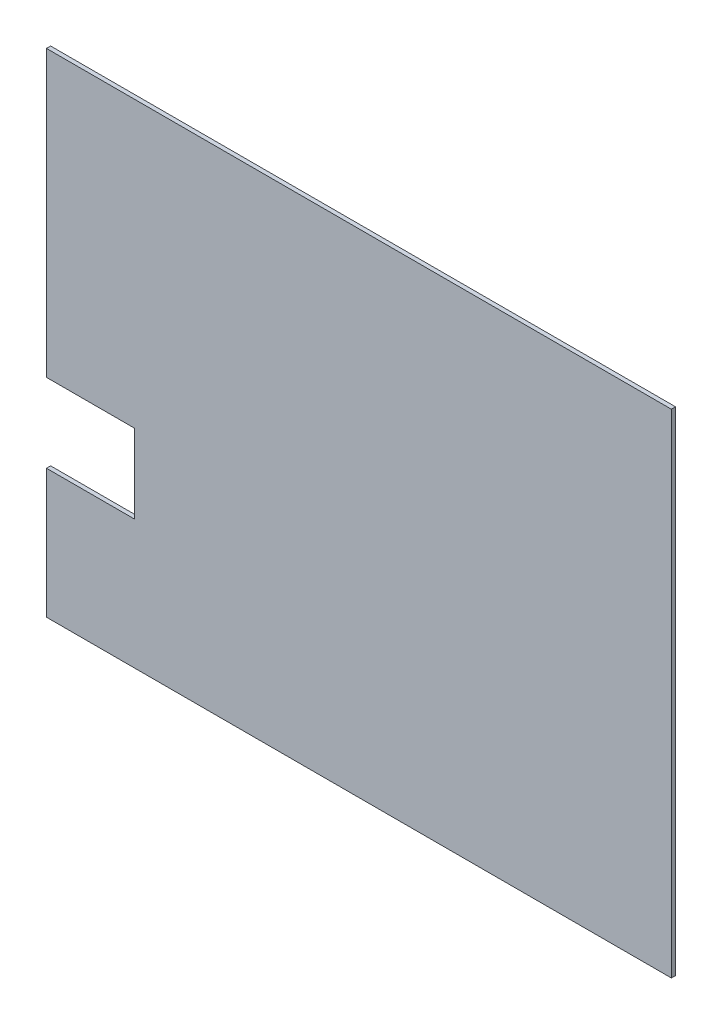
ISO-10303-21;
HEADER;
FILE_DESCRIPTION(('STEP AP214'),'2;1');
FILE_NAME('part.step','',(''),(''),'','','');
FILE_SCHEMA(('AUTOMOTIVE_DESIGN { 1 0 10303 214 1 1 1 1 }'));
ENDSEC;
DATA;
#1=APPLICATION_CONTEXT('core data for automotive mechanical design processes');
#2=APPLICATION_PROTOCOL_DEFINITION('international standard','automotive_design',2000,#1);
#3=PRODUCT_CONTEXT('',#1,'mechanical');
#4=PRODUCT('Part','Part','',(#3));
#5=PRODUCT_RELATED_PRODUCT_CATEGORY('part','',(#4));
#6=PRODUCT_DEFINITION_FORMATION('','',#4);
#7=PRODUCT_DEFINITION_CONTEXT('part definition',#1,'design');
#8=PRODUCT_DEFINITION('design','',#6,#7);
#9=PRODUCT_DEFINITION_SHAPE('','',#8);
#10=(LENGTH_UNIT() NAMED_UNIT(*) SI_UNIT(.MILLI.,.METRE.));
#11=(NAMED_UNIT(*) PLANE_ANGLE_UNIT() SI_UNIT($,.RADIAN.));
#12=(NAMED_UNIT(*) SI_UNIT($,.STERADIAN.) SOLID_ANGLE_UNIT());
#13=UNCERTAINTY_MEASURE_WITH_UNIT(LENGTH_MEASURE(1.E-05),#10,'distance_accuracy_value','');
#14=(GEOMETRIC_REPRESENTATION_CONTEXT(3) GLOBAL_UNCERTAINTY_ASSIGNED_CONTEXT((#13)) GLOBAL_UNIT_ASSIGNED_CONTEXT((#10,
#11,#12)) REPRESENTATION_CONTEXT('',''));
#15=CARTESIAN_POINT('',(0.,0.,0.));
#16=DIRECTION('',(0.,0.,1.));
#17=DIRECTION('',(1.,0.,0.));
#18=AXIS2_PLACEMENT_3D('',#15,#16,#17);
#19=CARTESIAN_POINT('',(-336.234937406532,-64.2589617486336,1.5));
#20=DIRECTION('',(1.,0.,0.));
#21=DIRECTION('',(0.,1.,0.));
#22=AXIS2_PLACEMENT_3D('',#19,#20,#21);
#23=PLANE('',#22);
#24=DIRECTION('',(0.,-1.,0.));
#25=VECTOR('',#24,1.);
#26=CARTESIAN_POINT('',(-336.234937406532,-64.2589617486336,0.));
#27=LINE('',#26,#25);
#28=CARTESIAN_POINT('',(-336.234937406532,-64.2589617486336,0.));
#29=VERTEX_POINT('',#28);
#30=CARTESIAN_POINT('',(-336.234937406532,-166.859938907239,0.));
#31=VERTEX_POINT('',#30);
#32=EDGE_CURVE('E144',#29,#31,#27,.T.);
#33=ORIENTED_EDGE('',*,*,#32,.T.);
#34=DIRECTION('',(0.,0.,1.));
#35=VECTOR('',#34,1.);
#36=CARTESIAN_POINT('',(-336.234937406532,-166.859938907239,1.5));
#37=LINE('',#36,#35);
#38=CARTESIAN_POINT('',(-336.234937406532,-166.859938907239,1.5));
#39=VERTEX_POINT('',#38);
#40=EDGE_CURVE('E132',#31,#39,#37,.T.);
#41=ORIENTED_EDGE('',*,*,#40,.T.);
#42=DIRECTION('',(0.,-1.,0.));
#43=VECTOR('',#42,1.);
#44=CARTESIAN_POINT('',(-336.234937406532,-64.2589617486336,1.5));
#45=LINE('',#44,#43);
#46=CARTESIAN_POINT('',(-336.234937406532,-64.2589617486336,1.5));
#47=VERTEX_POINT('',#46);
#48=EDGE_CURVE('E136',#47,#39,#45,.T.);
#49=ORIENTED_EDGE('',*,*,#48,.F.);
#50=DIRECTION('',(0.,0.,-1.));
#51=VECTOR('',#50,1.);
#52=CARTESIAN_POINT('',(-336.234937406532,-64.2589617486336,1.5));
#53=LINE('',#52,#51);
#54=EDGE_CURVE('E143',#47,#29,#53,.T.);
#55=ORIENTED_EDGE('',*,*,#54,.T.);
#56=EDGE_LOOP('',(#33,#41,#49,#55));
#57=FACE_BOUND('',#56,.T.);
#58=ADVANCED_FACE('F33',(#57),#23,.F.);
#59=CARTESIAN_POINT('',(-336.234937406532,-195.196290883907,1.5));
#60=VERTEX_POINT('',#59);
#61=CARTESIAN_POINT('',(-336.234937406532,-241.658961748633,1.5));
#62=VERTEX_POINT('',#61);
#63=EDGE_CURVE('E85',#60,#62,#45,.T.);
#64=ORIENTED_EDGE('',*,*,#63,.F.);
#65=DIRECTION('',(0.,0.,-1.));
#66=VECTOR('',#65,1.);
#67=CARTESIAN_POINT('',(-336.234937406532,-195.196290883907,1.5));
#68=LINE('',#67,#66);
#69=CARTESIAN_POINT('',(-336.234937406532,-195.196290883907,0.));
#70=VERTEX_POINT('',#69);
#71=EDGE_CURVE('E121',#60,#70,#68,.T.);
#72=ORIENTED_EDGE('',*,*,#71,.T.);
#73=CARTESIAN_POINT('',(-336.234937406532,-241.658961748633,0.));
#74=VERTEX_POINT('',#73);
#75=EDGE_CURVE('E135',#70,#74,#27,.T.);
#76=ORIENTED_EDGE('',*,*,#75,.T.);
#77=DIRECTION('',(0.,0.,-1.));
#78=VECTOR('',#77,1.);
#79=CARTESIAN_POINT('',(-336.234937406532,-241.658961748633,1.5));
#80=LINE('',#79,#78);
#81=EDGE_CURVE('E41',#62,#74,#80,.T.);
#82=ORIENTED_EDGE('',*,*,#81,.F.);
#83=EDGE_LOOP('',(#64,#72,#76,#82));
#84=FACE_BOUND('',#83,.T.);
#85=ADVANCED_FACE('F35',(#84),#23,.F.);
#86=CARTESIAN_POINT('',(-336.234937406532,-241.658961748633,1.5));
#87=DIRECTION('',(0.,1.,0.));
#88=DIRECTION('',(0.,0.,1.));
#89=AXIS2_PLACEMENT_3D('',#86,#87,#88);
#90=PLANE('',#89);
#91=DIRECTION('',(1.,0.,0.));
#92=VECTOR('',#91,1.);
#93=CARTESIAN_POINT('',(-336.234937406532,-241.658961748633,0.));
#94=LINE('',#93,#92);
#95=CARTESIAN_POINT('',(-111.18580242878,-241.658961748633,0.));
#96=VERTEX_POINT('',#95);
#97=EDGE_CURVE('E147',#74,#96,#94,.T.);
#98=ORIENTED_EDGE('',*,*,#97,.T.);
#99=DIRECTION('',(0.,0.,-1.));
#100=VECTOR('',#99,1.);
#101=CARTESIAN_POINT('',(-111.18580242878,-241.658961748633,1.5));
#102=LINE('',#101,#100);
#103=CARTESIAN_POINT('',(-111.18580242878,-241.658961748633,1.5));
#104=VERTEX_POINT('',#103);
#105=EDGE_CURVE('E155',#104,#96,#102,.T.);
#106=ORIENTED_EDGE('',*,*,#105,.F.);
#107=DIRECTION('',(1.,0.,0.));
#108=VECTOR('',#107,1.);
#109=CARTESIAN_POINT('',(-336.234937406532,-241.658961748633,1.5));
#110=LINE('',#109,#108);
#111=EDGE_CURVE('E138',#62,#104,#110,.T.);
#112=ORIENTED_EDGE('',*,*,#111,.F.);
#113=ORIENTED_EDGE('',*,*,#81,.T.);
#114=EDGE_LOOP('',(#98,#106,#112,#113));
#115=FACE_BOUND('',#114,.T.);
#116=ADVANCED_FACE('F160',(#115),#90,.F.);
#117=CARTESIAN_POINT('',(-111.18580242878,-64.2589617486336,1.5));
#118=DIRECTION('',(-1.,0.,0.));
#119=DIRECTION('',(0.,0.,1.));
#120=AXIS2_PLACEMENT_3D('',#117,#118,#119);
#121=PLANE('',#120);
#122=DIRECTION('',(0.,1.,0.));
#123=VECTOR('',#122,1.);
#124=CARTESIAN_POINT('',(-111.18580242878,-64.2589617486336,0.));
#125=LINE('',#124,#123);
#126=CARTESIAN_POINT('',(-111.18580242878,-64.2589617486336,0.));
#127=VERTEX_POINT('',#126);
#128=EDGE_CURVE('E149',#96,#127,#125,.T.);
#129=ORIENTED_EDGE('',*,*,#128,.T.);
#130=DIRECTION('',(0.,0.,-1.));
#131=VECTOR('',#130,1.);
#132=CARTESIAN_POINT('',(-111.18580242878,-64.2589617486336,1.5));
#133=LINE('',#132,#131);
#134=CARTESIAN_POINT('',(-111.18580242878,-64.2589617486336,1.5));
#135=VERTEX_POINT('',#134);
#136=EDGE_CURVE('E153',#135,#127,#133,.T.);
#137=ORIENTED_EDGE('',*,*,#136,.F.);
#138=DIRECTION('',(0.,1.,0.));
#139=VECTOR('',#138,1.);
#140=CARTESIAN_POINT('',(-111.18580242878,-64.2589617486336,1.5));
#141=LINE('',#140,#139);
#142=EDGE_CURVE('E140',#104,#135,#141,.T.);
#143=ORIENTED_EDGE('',*,*,#142,.F.);
#144=ORIENTED_EDGE('',*,*,#105,.T.);
#145=EDGE_LOOP('',(#129,#137,#143,#144));
#146=FACE_BOUND('',#145,.T.);
#147=ADVANCED_FACE('F171',(#146),#121,.F.);
#148=CARTESIAN_POINT('',(-336.234937406532,-64.2589617486336,1.5));
#149=DIRECTION('',(0.,-1.,0.));
#150=DIRECTION('',(1.,0.,0.));
#151=AXIS2_PLACEMENT_3D('',#148,#149,#150);
#152=PLANE('',#151);
#153=DIRECTION('',(-1.,0.,0.));
#154=VECTOR('',#153,1.);
#155=CARTESIAN_POINT('',(-336.234937406532,-64.2589617486336,0.));
#156=LINE('',#155,#154);
#157=EDGE_CURVE('E78',#127,#29,#156,.T.);
#158=ORIENTED_EDGE('',*,*,#157,.T.);
#159=ORIENTED_EDGE('',*,*,#54,.F.);
#160=DIRECTION('',(-1.,0.,0.));
#161=VECTOR('',#160,1.);
#162=CARTESIAN_POINT('',(-336.234937406532,-64.2589617486336,1.5));
#163=LINE('',#162,#161);
#164=EDGE_CURVE('E57',#135,#47,#163,.T.);
#165=ORIENTED_EDGE('',*,*,#164,.F.);
#166=ORIENTED_EDGE('',*,*,#136,.T.);
#167=EDGE_LOOP('',(#158,#159,#165,#166));
#168=FACE_BOUND('',#167,.T.);
#169=ADVANCED_FACE('F173',(#168),#152,.F.);
#170=CARTESIAN_POINT('',(0.,0.,1.5));
#171=DIRECTION('',(0.,0.,1.));
#172=DIRECTION('',(1.,0.,0.));
#173=AXIS2_PLACEMENT_3D('',#170,#171,#172);
#174=PLANE('',#173);
#175=DIRECTION('',(1.,0.,0.));
#176=VECTOR('',#175,1.);
#177=CARTESIAN_POINT('',(-304.521175175879,-166.859938907239,1.5));
#178=LINE('',#177,#176);
#179=CARTESIAN_POINT('',(-304.521175175879,-166.859938907239,1.5));
#180=VERTEX_POINT('',#179);
#181=EDGE_CURVE('E116',#39,#180,#178,.T.);
#182=ORIENTED_EDGE('',*,*,#181,.T.);
#183=DIRECTION('',(0.,-1.,0.));
#184=VECTOR('',#183,1.);
#185=CARTESIAN_POINT('',(-304.521175175879,-166.859938907239,1.5));
#186=LINE('',#185,#184);
#187=CARTESIAN_POINT('',(-304.521175175879,-195.196290883907,1.5));
#188=VERTEX_POINT('',#187);
#189=EDGE_CURVE('E111',#180,#188,#186,.T.);
#190=ORIENTED_EDGE('',*,*,#189,.T.);
#191=DIRECTION('',(-1.,0.,0.));
#192=VECTOR('',#191,1.);
#193=CARTESIAN_POINT('',(-304.521175175879,-195.196290883907,1.5));
#194=LINE('',#193,#192);
#195=EDGE_CURVE('E118',#188,#60,#194,.T.);
#196=ORIENTED_EDGE('',*,*,#195,.T.);
#197=ORIENTED_EDGE('',*,*,#63,.T.);
#198=ORIENTED_EDGE('',*,*,#111,.T.);
#199=ORIENTED_EDGE('',*,*,#142,.T.);
#200=ORIENTED_EDGE('',*,*,#164,.T.);
#201=ORIENTED_EDGE('',*,*,#48,.T.);
#202=EDGE_LOOP('',(#182,#190,#196,#197,#198,#199,#200,#201));
#203=FACE_BOUND('',#202,.T.);
#204=ADVANCED_FACE('F123',(#203),#174,.T.);
#205=CARTESIAN_POINT('',(0.,0.,0.));
#206=DIRECTION('',(0.,0.,1.));
#207=DIRECTION('',(1.,0.,0.));
#208=AXIS2_PLACEMENT_3D('',#205,#206,#207);
#209=PLANE('',#208);
#210=DIRECTION('',(0.,-1.,0.));
#211=VECTOR('',#210,1.);
#212=CARTESIAN_POINT('',(-304.521175175879,-166.859938907239,0.));
#213=LINE('',#212,#211);
#214=CARTESIAN_POINT('',(-304.521175175879,-166.859938907239,0.));
#215=VERTEX_POINT('',#214);
#216=CARTESIAN_POINT('',(-304.521175175879,-195.196290883907,0.));
#217=VERTEX_POINT('',#216);
#218=EDGE_CURVE('E48',#215,#217,#213,.T.);
#219=ORIENTED_EDGE('',*,*,#218,.F.);
#220=DIRECTION('',(-1.,0.,0.));
#221=VECTOR('',#220,1.);
#222=CARTESIAN_POINT('',(0.,-166.859938907239,0.));
#223=LINE('',#222,#221);
#224=EDGE_CURVE('E11',#215,#31,#223,.T.);
#225=ORIENTED_EDGE('',*,*,#224,.T.);
#226=ORIENTED_EDGE('',*,*,#32,.F.);
#227=ORIENTED_EDGE('',*,*,#157,.F.);
#228=ORIENTED_EDGE('',*,*,#128,.F.);
#229=ORIENTED_EDGE('',*,*,#97,.F.);
#230=ORIENTED_EDGE('',*,*,#75,.F.);
#231=DIRECTION('',(-1.,0.,0.));
#232=VECTOR('',#231,1.);
#233=CARTESIAN_POINT('',(-304.521175175879,-195.196290883907,0.));
#234=LINE('',#233,#232);
#235=EDGE_CURVE('E124',#217,#70,#234,.T.);
#236=ORIENTED_EDGE('',*,*,#235,.F.);
#237=EDGE_LOOP('',(#219,#225,#226,#227,#228,#229,#230,#236));
#238=FACE_BOUND('',#237,.T.);
#239=ADVANCED_FACE('F167',(#238),#209,.F.);
#240=CARTESIAN_POINT('',(-304.521175175879,-166.859938907239,1.5));
#241=DIRECTION('',(0.,1.,0.));
#242=DIRECTION('',(0.,0.,1.));
#243=AXIS2_PLACEMENT_3D('',#240,#241,#242);
#244=PLANE('',#243);
#245=ORIENTED_EDGE('',*,*,#224,.F.);
#246=DIRECTION('',(0.,0.,-1.));
#247=VECTOR('',#246,1.);
#248=CARTESIAN_POINT('',(-304.521175175879,-166.859938907239,1.5));
#249=LINE('',#248,#247);
#250=EDGE_CURVE('E115',#180,#215,#249,.T.);
#251=ORIENTED_EDGE('',*,*,#250,.F.);
#252=ORIENTED_EDGE('',*,*,#181,.F.);
#253=ORIENTED_EDGE('',*,*,#40,.F.);
#254=EDGE_LOOP('',(#245,#251,#252,#253));
#255=FACE_BOUND('',#254,.T.);
#256=ADVANCED_FACE('F177',(#255),#244,.F.);
#257=CARTESIAN_POINT('',(-304.521175175879,-195.196290883907,1.5));
#258=DIRECTION('',(0.,-1.,0.));
#259=DIRECTION('',(0.,0.,-1.));
#260=AXIS2_PLACEMENT_3D('',#257,#258,#259);
#261=PLANE('',#260);
#262=ORIENTED_EDGE('',*,*,#195,.F.);
#263=DIRECTION('',(0.,0.,-1.));
#264=VECTOR('',#263,1.);
#265=CARTESIAN_POINT('',(-304.521175175879,-195.196290883907,1.5));
#266=LINE('',#265,#264);
#267=EDGE_CURVE('E107',#188,#217,#266,.T.);
#268=ORIENTED_EDGE('',*,*,#267,.T.);
#269=ORIENTED_EDGE('',*,*,#235,.T.);
#270=ORIENTED_EDGE('',*,*,#71,.F.);
#271=EDGE_LOOP('',(#262,#268,#269,#270));
#272=FACE_BOUND('',#271,.T.);
#273=ADVANCED_FACE('F119',(#272),#261,.F.);
#274=CARTESIAN_POINT('',(-304.521175175879,-166.859938907239,1.5));
#275=DIRECTION('',(1.,0.,0.));
#276=DIRECTION('',(0.,0.,-1.));
#277=AXIS2_PLACEMENT_3D('',#274,#275,#276);
#278=PLANE('',#277);
#279=ORIENTED_EDGE('',*,*,#218,.T.);
#280=ORIENTED_EDGE('',*,*,#267,.F.);
#281=ORIENTED_EDGE('',*,*,#189,.F.);
#282=ORIENTED_EDGE('',*,*,#250,.T.);
#283=EDGE_LOOP('',(#279,#280,#281,#282));
#284=FACE_BOUND('',#283,.T.);
#285=ADVANCED_FACE('F109',(#284),#278,.F.);
#286=CLOSED_SHELL('',(#58,#85,#116,#147,#169,#204,#239,#256,#273,#285));
#287=MANIFOLD_SOLID_BREP('B2',#286);
#288=ADVANCED_BREP_SHAPE_REPRESENTATION('',(#18,#287),#14);
#289=SHAPE_DEFINITION_REPRESENTATION(#9,#288);
ENDSEC;
END-ISO-10303-21;
